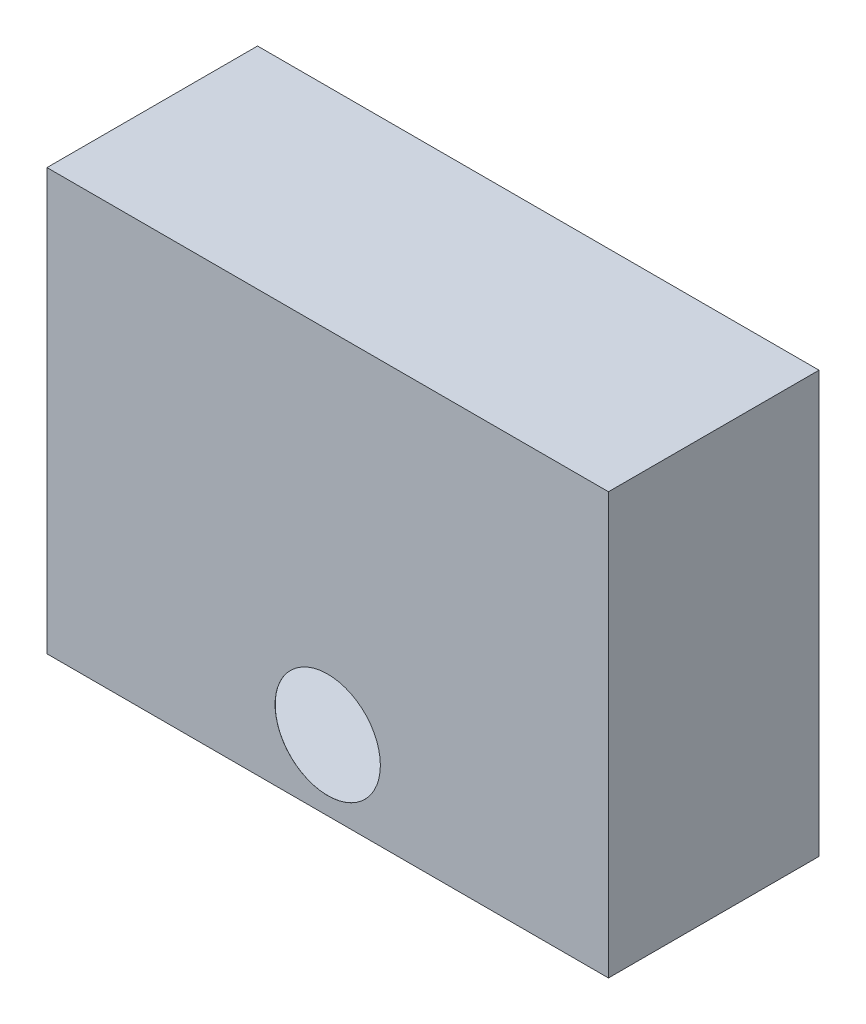
ISO-10303-21;
HEADER;
FILE_DESCRIPTION(('STEP AP214'),'2;1');
FILE_NAME('part.step','',(''),(''),'','','');
FILE_SCHEMA(('AUTOMOTIVE_DESIGN { 1 0 10303 214 1 1 1 1 }'));
ENDSEC;
DATA;
#1=APPLICATION_CONTEXT('core data for automotive mechanical design processes');
#2=APPLICATION_PROTOCOL_DEFINITION('international standard','automotive_design',2000,#1);
#3=PRODUCT_CONTEXT('',#1,'mechanical');
#4=PRODUCT('Part','Part','',(#3));
#5=PRODUCT_RELATED_PRODUCT_CATEGORY('part','',(#4));
#6=PRODUCT_DEFINITION_FORMATION('','',#4);
#7=PRODUCT_DEFINITION_CONTEXT('part definition',#1,'design');
#8=PRODUCT_DEFINITION('design','',#6,#7);
#9=PRODUCT_DEFINITION_SHAPE('','',#8);
#10=(LENGTH_UNIT() NAMED_UNIT(*) SI_UNIT(.MILLI.,.METRE.));
#11=(NAMED_UNIT(*) PLANE_ANGLE_UNIT() SI_UNIT($,.RADIAN.));
#12=(NAMED_UNIT(*) SI_UNIT($,.STERADIAN.) SOLID_ANGLE_UNIT());
#13=UNCERTAINTY_MEASURE_WITH_UNIT(LENGTH_MEASURE(1.E-05),#10,'distance_accuracy_value','');
#14=(GEOMETRIC_REPRESENTATION_CONTEXT(3) GLOBAL_UNCERTAINTY_ASSIGNED_CONTEXT((#13)) GLOBAL_UNIT_ASSIGNED_CONTEXT((#10,
#11,#12)) REPRESENTATION_CONTEXT('',''));
#15=CARTESIAN_POINT('',(0.,0.,0.));
#16=DIRECTION('',(0.,0.,1.));
#17=DIRECTION('',(1.,0.,0.));
#18=AXIS2_PLACEMENT_3D('',#15,#16,#17);
#19=CARTESIAN_POINT('',(39.,30.,30.));
#20=DIRECTION('',(-1.,0.,0.));
#21=DIRECTION('',(0.,-1.,0.));
#22=AXIS2_PLACEMENT_3D('',#19,#20,#21);
#23=PLANE('',#22);
#24=DIRECTION('',(0.,1.,0.));
#25=VECTOR('',#24,1.);
#26=CARTESIAN_POINT('',(39.,30.,1.));
#27=LINE('',#26,#25);
#28=CARTESIAN_POINT('',(39.,-29.,1.));
#29=VERTEX_POINT('',#28);
#30=CARTESIAN_POINT('',(39.,29.,1.));
#31=VERTEX_POINT('',#30);
#32=EDGE_CURVE('E40',#29,#31,#27,.T.);
#33=ORIENTED_EDGE('',*,*,#32,.F.);
#34=DIRECTION('',(0.,0.,-1.));
#35=VECTOR('',#34,1.);
#36=CARTESIAN_POINT('',(39.,-29.,30.));
#37=LINE('',#36,#35);
#38=CARTESIAN_POINT('',(39.,-29.,29.99));
#39=VERTEX_POINT('',#38);
#40=EDGE_CURVE('E166',#39,#29,#37,.T.);
#41=ORIENTED_EDGE('',*,*,#40,.F.);
#42=DIRECTION('',(0.,1.,0.));
#43=VECTOR('',#42,1.);
#44=CARTESIAN_POINT('',(39.,30.,29.99));
#45=LINE('',#44,#43);
#46=CARTESIAN_POINT('',(39.,29.,29.99));
#47=VERTEX_POINT('',#46);
#48=EDGE_CURVE('E153',#39,#47,#45,.T.);
#49=ORIENTED_EDGE('',*,*,#48,.T.);
#50=DIRECTION('',(0.,0.,-1.));
#51=VECTOR('',#50,1.);
#52=CARTESIAN_POINT('',(39.,29.,30.));
#53=LINE('',#52,#51);
#54=EDGE_CURVE('E164',#47,#31,#53,.T.);
#55=ORIENTED_EDGE('',*,*,#54,.T.);
#56=EDGE_LOOP('',(#33,#41,#49,#55));
#57=FACE_BOUND('',#56,.T.);
#58=ADVANCED_FACE('F36',(#57),#23,.T.);
#59=CARTESIAN_POINT('',(-40.,29.,30.));
#60=DIRECTION('',(0.,-1.,0.));
#61=DIRECTION('',(0.,0.,-1.));
#62=AXIS2_PLACEMENT_3D('',#59,#60,#61);
#63=PLANE('',#62);
#64=DIRECTION('',(-1.,0.,0.));
#65=VECTOR('',#64,1.);
#66=CARTESIAN_POINT('',(-40.,29.,1.));
#67=LINE('',#66,#65);
#68=CARTESIAN_POINT('',(-39.,29.,1.));
#69=VERTEX_POINT('',#68);
#70=EDGE_CURVE('E55',#31,#69,#67,.T.);
#71=ORIENTED_EDGE('',*,*,#70,.F.);
#72=ORIENTED_EDGE('',*,*,#54,.F.);
#73=DIRECTION('',(-1.,0.,0.));
#74=VECTOR('',#73,1.);
#75=CARTESIAN_POINT('',(-40.,29.,29.99));
#76=LINE('',#75,#74);
#77=CARTESIAN_POINT('',(-39.,29.,29.99));
#78=VERTEX_POINT('',#77);
#79=EDGE_CURVE('E78',#47,#78,#76,.T.);
#80=ORIENTED_EDGE('',*,*,#79,.T.);
#81=DIRECTION('',(0.,0.,-1.));
#82=VECTOR('',#81,1.);
#83=CARTESIAN_POINT('',(-39.,29.,30.));
#84=LINE('',#83,#82);
#85=EDGE_CURVE('E160',#78,#69,#84,.T.);
#86=ORIENTED_EDGE('',*,*,#85,.T.);
#87=EDGE_LOOP('',(#71,#72,#80,#86));
#88=FACE_BOUND('',#87,.T.);
#89=ADVANCED_FACE('F173',(#88),#63,.T.);
#90=CARTESIAN_POINT('',(-39.,30.,30.));
#91=DIRECTION('',(1.,0.,0.));
#92=DIRECTION('',(0.,1.,0.));
#93=AXIS2_PLACEMENT_3D('',#90,#91,#92);
#94=PLANE('',#93);
#95=DIRECTION('',(0.,-1.,0.));
#96=VECTOR('',#95,1.);
#97=CARTESIAN_POINT('',(-39.,30.,1.));
#98=LINE('',#97,#96);
#99=CARTESIAN_POINT('',(-39.,-29.,1.));
#100=VERTEX_POINT('',#99);
#101=EDGE_CURVE('E162',#69,#100,#98,.T.);
#102=ORIENTED_EDGE('',*,*,#101,.F.);
#103=ORIENTED_EDGE('',*,*,#85,.F.);
#104=DIRECTION('',(0.,-1.,0.));
#105=VECTOR('',#104,1.);
#106=CARTESIAN_POINT('',(-39.,30.,29.99));
#107=LINE('',#106,#105);
#108=CARTESIAN_POINT('',(-39.,-29.,29.99));
#109=VERTEX_POINT('',#108);
#110=EDGE_CURVE('E46',#78,#109,#107,.T.);
#111=ORIENTED_EDGE('',*,*,#110,.T.);
#112=DIRECTION('',(0.,0.,-1.));
#113=VECTOR('',#112,1.);
#114=CARTESIAN_POINT('',(-39.,-29.,30.));
#115=LINE('',#114,#113);
#116=EDGE_CURVE('E155',#109,#100,#115,.T.);
#117=ORIENTED_EDGE('',*,*,#116,.T.);
#118=EDGE_LOOP('',(#102,#103,#111,#117));
#119=FACE_BOUND('',#118,.T.);
#120=ADVANCED_FACE('F177',(#119),#94,.T.);
#121=CARTESIAN_POINT('',(-40.,-29.,30.));
#122=DIRECTION('',(0.,1.,0.));
#123=DIRECTION('',(0.,0.,1.));
#124=AXIS2_PLACEMENT_3D('',#121,#122,#123);
#125=PLANE('',#124);
#126=DIRECTION('',(1.,0.,0.));
#127=VECTOR('',#126,1.);
#128=CARTESIAN_POINT('',(-40.,-29.,1.));
#129=LINE('',#128,#127);
#130=EDGE_CURVE('E158',#100,#29,#129,.T.);
#131=ORIENTED_EDGE('',*,*,#130,.F.);
#132=ORIENTED_EDGE('',*,*,#116,.F.);
#133=DIRECTION('',(1.,0.,0.));
#134=VECTOR('',#133,1.);
#135=CARTESIAN_POINT('',(-40.,-29.,29.99));
#136=LINE('',#135,#134);
#137=EDGE_CURVE('E11',#109,#39,#136,.T.);
#138=ORIENTED_EDGE('',*,*,#137,.T.);
#139=ORIENTED_EDGE('',*,*,#40,.T.);
#140=EDGE_LOOP('',(#131,#132,#138,#139));
#141=FACE_BOUND('',#140,.T.);
#142=ADVANCED_FACE('F181',(#141),#125,.T.);
#143=CARTESIAN_POINT('',(0.,0.,29.99));
#144=DIRECTION('',(0.,0.,1.));
#145=DIRECTION('',(1.,0.,0.));
#146=AXIS2_PLACEMENT_3D('',#143,#144,#145);
#147=PLANE('',#146);
#148=CARTESIAN_POINT('',(0.,-20.,29.99));
#149=DIRECTION('',(0.,0.,1.));
#150=DIRECTION('',(1.,0.,0.));
#151=AXIS2_PLACEMENT_3D('',#148,#149,#150);
#152=CIRCLE('',#151,7.5);
#153=CARTESIAN_POINT('',(7.5,-20.,29.99));
#154=VERTEX_POINT('',#153);
#155=EDGE_CURVE('E226',#154,#154,#152,.F.);
#156=ORIENTED_EDGE('',*,*,#155,.F.);
#157=EDGE_LOOP('',(#156));
#158=FACE_BOUND('',#157,.T.);
#159=ORIENTED_EDGE('',*,*,#48,.F.);
#160=ORIENTED_EDGE('',*,*,#137,.F.);
#161=ORIENTED_EDGE('',*,*,#110,.F.);
#162=ORIENTED_EDGE('',*,*,#79,.F.);
#163=EDGE_LOOP('',(#159,#160,#161,#162));
#164=FACE_BOUND('',#163,.T.);
#165=ADVANCED_FACE('F180',(#158,#164),#147,.F.);
#166=CARTESIAN_POINT('',(0.,0.,1.));
#167=DIRECTION('',(0.,0.,1.));
#168=DIRECTION('',(1.,0.,0.));
#169=AXIS2_PLACEMENT_3D('',#166,#167,#168);
#170=PLANE('',#169);
#171=ORIENTED_EDGE('',*,*,#32,.T.);
#172=ORIENTED_EDGE('',*,*,#70,.T.);
#173=ORIENTED_EDGE('',*,*,#101,.T.);
#174=ORIENTED_EDGE('',*,*,#130,.T.);
#175=EDGE_LOOP('',(#171,#172,#173,#174));
#176=FACE_BOUND('',#175,.T.);
#177=ADVANCED_FACE('F38',(#176),#170,.T.);
#178=CARTESIAN_POINT('',(0.,-20.,-0.001000000000001));
#179=DIRECTION('',(0.,0.,1.));
#180=DIRECTION('',(1.,0.,0.));
#181=AXIS2_PLACEMENT_3D('',#178,#179,#180);
#182=CYLINDRICAL_SURFACE('',#181,7.5);
#183=CARTESIAN_POINT('',(0.,-20.,30.));
#184=DIRECTION('',(0.,0.,1.));
#185=DIRECTION('',(1.,0.,0.));
#186=AXIS2_PLACEMENT_3D('',#183,#184,#185);
#187=CIRCLE('',#186,7.5);
#188=CARTESIAN_POINT('',(7.5,-20.,30.));
#189=VERTEX_POINT('',#188);
#190=EDGE_CURVE('E144',#189,#189,#187,.T.);
#191=ORIENTED_EDGE('',*,*,#190,.T.);
#192=EDGE_LOOP('',(#191));
#193=FACE_BOUND('',#192,.T.);
#194=ORIENTED_EDGE('',*,*,#155,.T.);
#195=EDGE_LOOP('',(#194));
#196=FACE_BOUND('',#195,.T.);
#197=ADVANCED_FACE('F200',(#193,#196),#182,.F.);
#198=CARTESIAN_POINT('',(40.,30.,30.));
#199=DIRECTION('',(-1.,0.,0.));
#200=DIRECTION('',(0.,-1.,0.));
#201=AXIS2_PLACEMENT_3D('',#198,#199,#200);
#202=PLANE('',#201);
#203=DIRECTION('',(0.,1.,0.));
#204=VECTOR('',#203,1.);
#205=CARTESIAN_POINT('',(40.,30.,0.));
#206=LINE('',#205,#204);
#207=CARTESIAN_POINT('',(40.,-30.,0.));
#208=VERTEX_POINT('',#207);
#209=CARTESIAN_POINT('',(40.,30.,0.));
#210=VERTEX_POINT('',#209);
#211=EDGE_CURVE('E141',#208,#210,#206,.T.);
#212=ORIENTED_EDGE('',*,*,#211,.T.);
#213=DIRECTION('',(0.,0.,-1.));
#214=VECTOR('',#213,1.);
#215=CARTESIAN_POINT('',(40.,30.,30.));
#216=LINE('',#215,#214);
#217=CARTESIAN_POINT('',(40.,30.,30.));
#218=VERTEX_POINT('',#217);
#219=EDGE_CURVE('E132',#218,#210,#216,.T.);
#220=ORIENTED_EDGE('',*,*,#219,.F.);
#221=DIRECTION('',(0.,1.,0.));
#222=VECTOR('',#221,1.);
#223=CARTESIAN_POINT('',(40.,30.,30.));
#224=LINE('',#223,#222);
#225=CARTESIAN_POINT('',(40.,-30.,30.));
#226=VERTEX_POINT('',#225);
#227=EDGE_CURVE('E126',#226,#218,#224,.T.);
#228=ORIENTED_EDGE('',*,*,#227,.F.);
#229=DIRECTION('',(0.,0.,-1.));
#230=VECTOR('',#229,1.);
#231=CARTESIAN_POINT('',(40.,-30.,30.));
#232=LINE('',#231,#230);
#233=EDGE_CURVE('E137',#226,#208,#232,.T.);
#234=ORIENTED_EDGE('',*,*,#233,.T.);
#235=EDGE_LOOP('',(#212,#220,#228,#234));
#236=FACE_BOUND('',#235,.T.);
#237=ADVANCED_FACE('F197',(#236),#202,.F.);
#238=CARTESIAN_POINT('',(-40.,30.,30.));
#239=DIRECTION('',(0.,-1.,0.));
#240=DIRECTION('',(0.,0.,-1.));
#241=AXIS2_PLACEMENT_3D('',#238,#239,#240);
#242=PLANE('',#241);
#243=DIRECTION('',(-1.,0.,0.));
#244=VECTOR('',#243,1.);
#245=CARTESIAN_POINT('',(-40.,30.,0.));
#246=LINE('',#245,#244);
#247=CARTESIAN_POINT('',(-40.,30.,0.));
#248=VERTEX_POINT('',#247);
#249=EDGE_CURVE('E131',#210,#248,#246,.T.);
#250=ORIENTED_EDGE('',*,*,#249,.T.);
#251=DIRECTION('',(0.,0.,-1.));
#252=VECTOR('',#251,1.);
#253=CARTESIAN_POINT('',(-40.,30.,30.));
#254=LINE('',#253,#252);
#255=CARTESIAN_POINT('',(-40.,30.,30.));
#256=VERTEX_POINT('',#255);
#257=EDGE_CURVE('E129',#256,#248,#254,.T.);
#258=ORIENTED_EDGE('',*,*,#257,.F.);
#259=DIRECTION('',(-1.,0.,0.));
#260=VECTOR('',#259,1.);
#261=CARTESIAN_POINT('',(-40.,30.,30.));
#262=LINE('',#261,#260);
#263=EDGE_CURVE('E121',#218,#256,#262,.T.);
#264=ORIENTED_EDGE('',*,*,#263,.F.);
#265=ORIENTED_EDGE('',*,*,#219,.T.);
#266=EDGE_LOOP('',(#250,#258,#264,#265));
#267=FACE_BOUND('',#266,.T.);
#268=ADVANCED_FACE('F130',(#267),#242,.F.);
#269=CARTESIAN_POINT('',(-40.,30.,30.));
#270=DIRECTION('',(1.,0.,0.));
#271=DIRECTION('',(0.,1.,0.));
#272=AXIS2_PLACEMENT_3D('',#269,#270,#271);
#273=PLANE('',#272);
#274=DIRECTION('',(0.,-1.,0.));
#275=VECTOR('',#274,1.);
#276=CARTESIAN_POINT('',(-40.,30.,0.));
#277=LINE('',#276,#275);
#278=CARTESIAN_POINT('',(-40.,-30.,0.));
#279=VERTEX_POINT('',#278);
#280=EDGE_CURVE('E107',#248,#279,#277,.T.);
#281=ORIENTED_EDGE('',*,*,#280,.T.);
#282=DIRECTION('',(0.,0.,-1.));
#283=VECTOR('',#282,1.);
#284=CARTESIAN_POINT('',(-40.,-30.,30.));
#285=LINE('',#284,#283);
#286=CARTESIAN_POINT('',(-40.,-30.,30.));
#287=VERTEX_POINT('',#286);
#288=EDGE_CURVE('E133',#287,#279,#285,.T.);
#289=ORIENTED_EDGE('',*,*,#288,.F.);
#290=DIRECTION('',(0.,-1.,0.));
#291=VECTOR('',#290,1.);
#292=CARTESIAN_POINT('',(-40.,30.,30.));
#293=LINE('',#292,#291);
#294=EDGE_CURVE('E124',#256,#287,#293,.T.);
#295=ORIENTED_EDGE('',*,*,#294,.F.);
#296=ORIENTED_EDGE('',*,*,#257,.T.);
#297=EDGE_LOOP('',(#281,#289,#295,#296));
#298=FACE_BOUND('',#297,.T.);
#299=ADVANCED_FACE('F135',(#298),#273,.F.);
#300=CARTESIAN_POINT('',(-40.,-30.,30.));
#301=DIRECTION('',(0.,1.,0.));
#302=DIRECTION('',(0.,0.,1.));
#303=AXIS2_PLACEMENT_3D('',#300,#301,#302);
#304=PLANE('',#303);
#305=DIRECTION('',(1.,0.,0.));
#306=VECTOR('',#305,1.);
#307=CARTESIAN_POINT('',(-40.,-30.,0.));
#308=LINE('',#307,#306);
#309=EDGE_CURVE('E113',#279,#208,#308,.T.);
#310=ORIENTED_EDGE('',*,*,#309,.T.);
#311=ORIENTED_EDGE('',*,*,#233,.F.);
#312=DIRECTION('',(1.,0.,0.));
#313=VECTOR('',#312,1.);
#314=CARTESIAN_POINT('',(-40.,-30.,30.));
#315=LINE('',#314,#313);
#316=EDGE_CURVE('E90',#287,#226,#315,.T.);
#317=ORIENTED_EDGE('',*,*,#316,.F.);
#318=ORIENTED_EDGE('',*,*,#288,.T.);
#319=EDGE_LOOP('',(#310,#311,#317,#318));
#320=FACE_BOUND('',#319,.T.);
#321=ADVANCED_FACE('F206',(#320),#304,.F.);
#322=CARTESIAN_POINT('',(0.,0.,30.));
#323=DIRECTION('',(0.,0.,1.));
#324=DIRECTION('',(1.,0.,0.));
#325=AXIS2_PLACEMENT_3D('',#322,#323,#324);
#326=PLANE('',#325);
#327=ORIENTED_EDGE('',*,*,#190,.F.);
#328=EDGE_LOOP('',(#327));
#329=FACE_BOUND('',#328,.T.);
#330=ORIENTED_EDGE('',*,*,#227,.T.);
#331=ORIENTED_EDGE('',*,*,#263,.T.);
#332=ORIENTED_EDGE('',*,*,#294,.T.);
#333=ORIENTED_EDGE('',*,*,#316,.T.);
#334=EDGE_LOOP('',(#330,#331,#332,#333));
#335=FACE_BOUND('',#334,.T.);
#336=ADVANCED_FACE('F122',(#329,#335),#326,.T.);
#337=CARTESIAN_POINT('',(0.,0.,0.));
#338=DIRECTION('',(0.,0.,1.));
#339=DIRECTION('',(1.,0.,0.));
#340=AXIS2_PLACEMENT_3D('',#337,#338,#339);
#341=PLANE('',#340);
#342=ORIENTED_EDGE('',*,*,#211,.F.);
#343=ORIENTED_EDGE('',*,*,#309,.F.);
#344=ORIENTED_EDGE('',*,*,#280,.F.);
#345=ORIENTED_EDGE('',*,*,#249,.F.);
#346=EDGE_LOOP('',(#342,#343,#344,#345));
#347=FACE_BOUND('',#346,.T.);
#348=ADVANCED_FACE('F209',(#347),#341,.F.);
#349=CLOSED_SHELL('',(#58,#89,#120,#142,#165,#177,#197,#237,#268,#299,#321,#336,#348));
#350=MANIFOLD_SOLID_BREP('B2',#349);
#351=ADVANCED_BREP_SHAPE_REPRESENTATION('',(#18,#350),#14);
#352=SHAPE_DEFINITION_REPRESENTATION(#9,#351);
ENDSEC;
END-ISO-10303-21;
